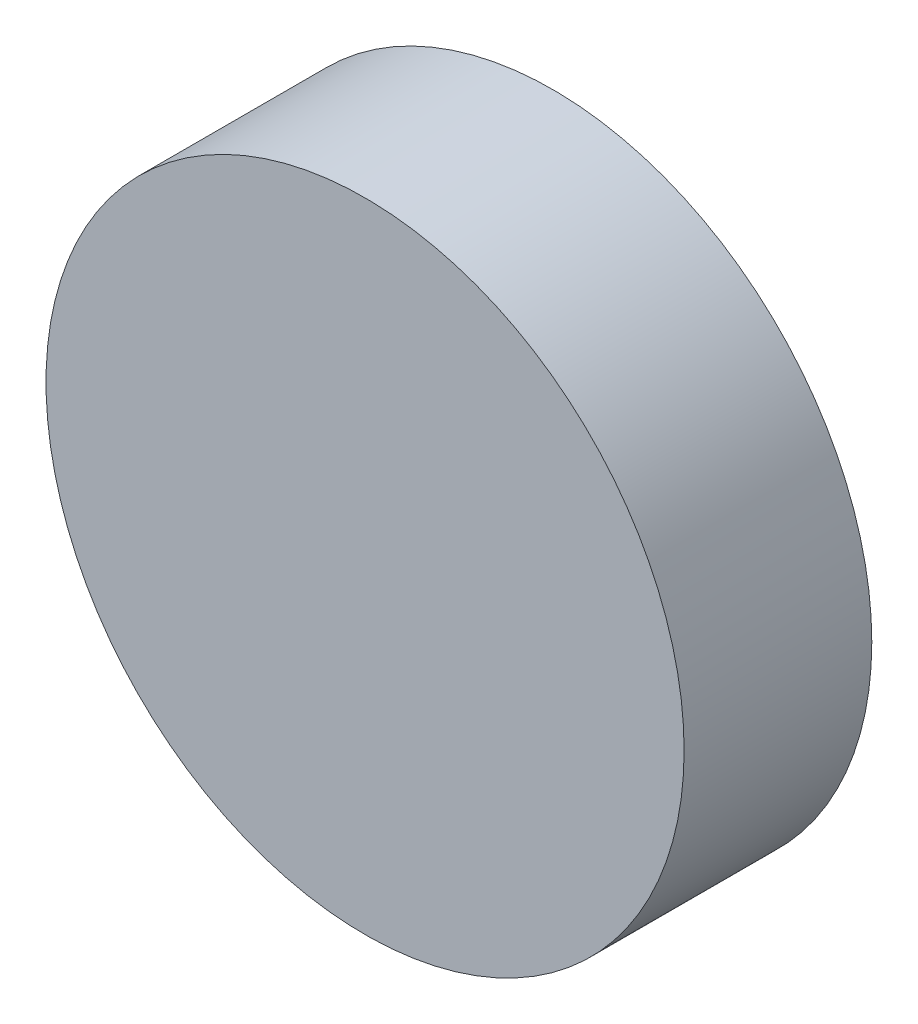
ISO-10303-21;
HEADER;
FILE_DESCRIPTION(('STEP AP214'),'2;1');
FILE_NAME('part.step','',(''),(''),'','','');
FILE_SCHEMA(('AUTOMOTIVE_DESIGN { 1 0 10303 214 1 1 1 1 }'));
ENDSEC;
DATA;
#1=APPLICATION_CONTEXT('core data for automotive mechanical design processes');
#2=APPLICATION_PROTOCOL_DEFINITION('international standard','automotive_design',2000,#1);
#3=PRODUCT_CONTEXT('',#1,'mechanical');
#4=PRODUCT('Part','Part','',(#3));
#5=PRODUCT_RELATED_PRODUCT_CATEGORY('part','',(#4));
#6=PRODUCT_DEFINITION_FORMATION('','',#4);
#7=PRODUCT_DEFINITION_CONTEXT('part definition',#1,'design');
#8=PRODUCT_DEFINITION('design','',#6,#7);
#9=PRODUCT_DEFINITION_SHAPE('','',#8);
#10=(LENGTH_UNIT() NAMED_UNIT(*) SI_UNIT(.MILLI.,.METRE.));
#11=(NAMED_UNIT(*) PLANE_ANGLE_UNIT() SI_UNIT($,.RADIAN.));
#12=(NAMED_UNIT(*) SI_UNIT($,.STERADIAN.) SOLID_ANGLE_UNIT());
#13=UNCERTAINTY_MEASURE_WITH_UNIT(LENGTH_MEASURE(1.E-05),#10,'distance_accuracy_value','');
#14=(GEOMETRIC_REPRESENTATION_CONTEXT(3) GLOBAL_UNCERTAINTY_ASSIGNED_CONTEXT((#13)) GLOBAL_UNIT_ASSIGNED_CONTEXT((#10,
#11,#12)) REPRESENTATION_CONTEXT('',''));
#15=CARTESIAN_POINT('',(0.,0.,0.));
#16=DIRECTION('',(0.,0.,1.));
#17=DIRECTION('',(1.,0.,0.));
#18=AXIS2_PLACEMENT_3D('',#15,#16,#17);
#19=CARTESIAN_POINT('',(0.,0.,10.));
#20=DIRECTION('',(0.,0.,-1.));
#21=DIRECTION('',(-1.,0.,0.));
#22=AXIS2_PLACEMENT_3D('',#19,#20,#21);
#23=CYLINDRICAL_SURFACE('',#22,17.);
#24=CARTESIAN_POINT('',(0.,0.,10.));
#25=DIRECTION('',(0.,0.,1.));
#26=DIRECTION('',(1.,0.,0.));
#27=AXIS2_PLACEMENT_3D('',#24,#25,#26);
#28=CIRCLE('',#27,17.);
#29=CARTESIAN_POINT('',(17.,0.,10.));
#30=VERTEX_POINT('',#29);
#31=EDGE_CURVE('E10',#30,#30,#28,.T.);
#32=ORIENTED_EDGE('',*,*,#31,.F.);
#33=EDGE_LOOP('',(#32));
#34=FACE_BOUND('',#33,.T.);
#35=CARTESIAN_POINT('',(0.,0.,0.));
#36=DIRECTION('',(0.,0.,1.));
#37=DIRECTION('',(1.,0.,0.));
#38=AXIS2_PLACEMENT_3D('',#35,#36,#37);
#39=CIRCLE('',#38,17.);
#40=CARTESIAN_POINT('',(17.,0.,0.));
#41=VERTEX_POINT('',#40);
#42=EDGE_CURVE('E33',#41,#41,#39,.T.);
#43=ORIENTED_EDGE('',*,*,#42,.T.);
#44=EDGE_LOOP('',(#43));
#45=FACE_BOUND('',#44,.T.);
#46=ADVANCED_FACE('F30',(#34,#45),#23,.T.);
#47=CARTESIAN_POINT('',(0.,0.,10.));
#48=DIRECTION('',(0.,0.,1.));
#49=DIRECTION('',(1.,0.,0.));
#50=AXIS2_PLACEMENT_3D('',#47,#48,#49);
#51=PLANE('',#50);
#52=ORIENTED_EDGE('',*,*,#31,.T.);
#53=EDGE_LOOP('',(#52));
#54=FACE_BOUND('',#53,.T.);
#55=ADVANCED_FACE('F45',(#54),#51,.T.);
#56=CARTESIAN_POINT('',(0.,0.,0.));
#57=DIRECTION('',(0.,0.,1.));
#58=DIRECTION('',(1.,0.,0.));
#59=AXIS2_PLACEMENT_3D('',#56,#57,#58);
#60=PLANE('',#59);
#61=ORIENTED_EDGE('',*,*,#42,.F.);
#62=EDGE_LOOP('',(#61));
#63=FACE_BOUND('',#62,.T.);
#64=ADVANCED_FACE('F43',(#63),#60,.F.);
#65=CLOSED_SHELL('',(#46,#55,#64));
#66=MANIFOLD_SOLID_BREP('B2',#65);
#67=ADVANCED_BREP_SHAPE_REPRESENTATION('',(#18,#66),#14);
#68=SHAPE_DEFINITION_REPRESENTATION(#9,#67);
ENDSEC;
END-ISO-10303-21;
